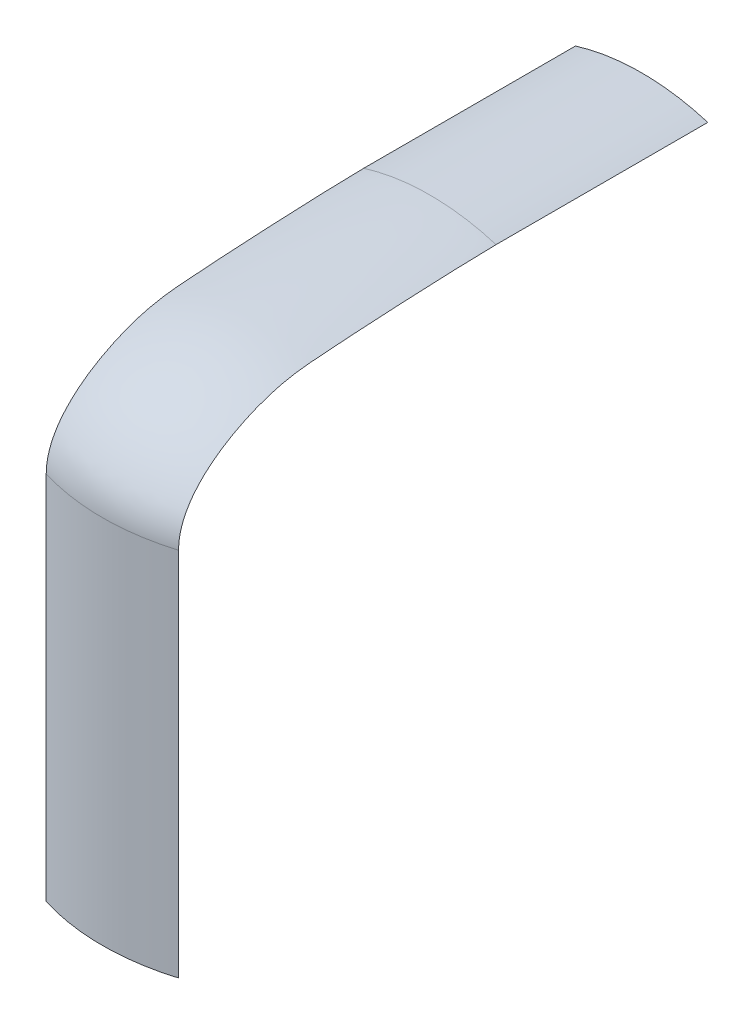
ISO-10303-21;
HEADER;
FILE_DESCRIPTION(('STEP AP214'),'2;1');
FILE_NAME('part.step','',(''),(''),'','','');
FILE_SCHEMA(('AUTOMOTIVE_DESIGN { 1 0 10303 214 1 1 1 1 }'));
ENDSEC;
DATA;
#1=APPLICATION_CONTEXT('core data for automotive mechanical design processes');
#2=APPLICATION_PROTOCOL_DEFINITION('international standard','automotive_design',2000,#1);
#3=PRODUCT_CONTEXT('',#1,'mechanical');
#4=PRODUCT('Part','Part','',(#3));
#5=PRODUCT_RELATED_PRODUCT_CATEGORY('part','',(#4));
#6=PRODUCT_DEFINITION_FORMATION('','',#4);
#7=PRODUCT_DEFINITION_CONTEXT('part definition',#1,'design');
#8=PRODUCT_DEFINITION('design','',#6,#7);
#9=PRODUCT_DEFINITION_SHAPE('','',#8);
#10=(LENGTH_UNIT() NAMED_UNIT(*) SI_UNIT(.MILLI.,.METRE.));
#11=(NAMED_UNIT(*) PLANE_ANGLE_UNIT() SI_UNIT($,.RADIAN.));
#12=(NAMED_UNIT(*) SI_UNIT($,.STERADIAN.) SOLID_ANGLE_UNIT());
#13=UNCERTAINTY_MEASURE_WITH_UNIT(LENGTH_MEASURE(1.E-05),#10,'distance_accuracy_value','');
#14=(GEOMETRIC_REPRESENTATION_CONTEXT(3) GLOBAL_UNCERTAINTY_ASSIGNED_CONTEXT((#13)) GLOBAL_UNIT_ASSIGNED_CONTEXT((#10,
#11,#12)) REPRESENTATION_CONTEXT('',''));
#15=CARTESIAN_POINT('',(0.,0.,0.));
#16=DIRECTION('',(0.,0.,1.));
#17=DIRECTION('',(1.,0.,0.));
#18=AXIS2_PLACEMENT_3D('',#15,#16,#17);
#19=CARTESIAN_POINT('',(0.,-180.,200.));
#20=DIRECTION('',(0.,-1.,0.));
#21=DIRECTION('',(1.,0.,0.));
#22=AXIS2_PLACEMENT_3D('',#19,#20,#21);
#23=PLANE('',#22);
#24=CARTESIAN_POINT('',(0.,-180.,281.458333333333));
#25=DIRECTION('',(0.,-1.,0.));
#26=DIRECTION('',(1.,0.,0.));
#27=AXIS2_PLACEMENT_3D('',#24,#25,#26);
#28=CIRCLE('',#27,85.2083333333334);
#29=CARTESIAN_POINT('',(-25.,-180.,200.));
#30=VERTEX_POINT('',#29);
#31=CARTESIAN_POINT('',(25.,-180.,200.));
#32=VERTEX_POINT('',#31);
#33=EDGE_CURVE('E78',#30,#32,#28,.T.);
#34=ORIENTED_EDGE('',*,*,#33,.T.);
#35=CARTESIAN_POINT('',(0.,-180.,118.541666666667));
#36=DIRECTION('',(0.,-1.,0.));
#37=DIRECTION('',(-1.,0.,0.));
#38=AXIS2_PLACEMENT_3D('',#35,#36,#37);
#39=CIRCLE('',#38,85.2083333333334);
#40=EDGE_CURVE('E87',#32,#30,#39,.T.);
#41=ORIENTED_EDGE('',*,*,#40,.T.);
#42=EDGE_LOOP('',(#34,#41));
#43=FACE_BOUND('',#42,.T.);
#44=ADVANCED_FACE('F33',(#43),#23,.T.);
#45=CARTESIAN_POINT('',(0.,0.,0.));
#46=DIRECTION('',(0.,0.,1.));
#47=DIRECTION('',(1.,0.,0.));
#48=AXIS2_PLACEMENT_3D('',#45,#46,#47);
#49=PLANE('',#48);
#50=CARTESIAN_POINT('',(0.,81.4583333333334,0.));
#51=DIRECTION('',(0.,0.,1.));
#52=DIRECTION('',(1.,0.,0.));
#53=AXIS2_PLACEMENT_3D('',#50,#51,#52);
#54=CIRCLE('',#53,85.2083333333334);
#55=CARTESIAN_POINT('',(-25.,0.,0.));
#56=VERTEX_POINT('',#55);
#57=CARTESIAN_POINT('',(25.,0.,0.));
#58=VERTEX_POINT('',#57);
#59=EDGE_CURVE('E51',#56,#58,#54,.T.);
#60=ORIENTED_EDGE('',*,*,#59,.F.);
#61=CARTESIAN_POINT('',(0.,-81.4583333333334,0.));
#62=DIRECTION('',(0.,0.,1.));
#63=DIRECTION('',(-1.,0.,0.));
#64=AXIS2_PLACEMENT_3D('',#61,#62,#63);
#65=CIRCLE('',#64,85.2083333333334);
#66=EDGE_CURVE('E11',#58,#56,#65,.T.);
#67=ORIENTED_EDGE('',*,*,#66,.F.);
#68=EDGE_LOOP('',(#60,#67));
#69=FACE_BOUND('',#68,.T.);
#70=ADVANCED_FACE('F146',(#69),#49,.F.);
#71=CARTESIAN_POINT('',(0.,-180.,281.458333333333));
#72=DIRECTION('',(0.,1.,0.));
#73=DIRECTION('',(0.,0.,1.));
#74=AXIS2_PLACEMENT_3D('',#71,#72,#73);
#75=CYLINDRICAL_SURFACE('',#74,85.2083333333334);
#76=DIRECTION('',(0.,1.,0.));
#77=VECTOR('',#76,1.);
#78=CARTESIAN_POINT('',(25.,-180.,200.));
#79=LINE('',#78,#77);
#80=CARTESIAN_POINT('',(25.,-40.0000000000001,200.));
#81=VERTEX_POINT('',#80);
#82=EDGE_CURVE('E85',#32,#81,#79,.T.);
#83=ORIENTED_EDGE('',*,*,#82,.F.);
#84=ORIENTED_EDGE('',*,*,#33,.F.);
#85=DIRECTION('',(0.,1.,0.));
#86=VECTOR('',#85,1.);
#87=CARTESIAN_POINT('',(-25.,-180.,200.));
#88=LINE('',#87,#86);
#89=CARTESIAN_POINT('',(-25.,-40.0000000000001,200.));
#90=VERTEX_POINT('',#89);
#91=EDGE_CURVE('E83',#30,#90,#88,.T.);
#92=ORIENTED_EDGE('',*,*,#91,.T.);
#93=CARTESIAN_POINT('',(0.,-40.0000000000001,281.458333333333));
#94=DIRECTION('',(0.,-1.,0.));
#95=DIRECTION('',(1.,0.,0.));
#96=AXIS2_PLACEMENT_3D('',#93,#94,#95);
#97=CIRCLE('',#96,85.2083333333334);
#98=EDGE_CURVE('E96',#90,#81,#97,.T.);
#99=ORIENTED_EDGE('',*,*,#98,.T.);
#100=EDGE_LOOP('',(#83,#84,#92,#99));
#101=FACE_BOUND('',#100,.T.);
#102=ADVANCED_FACE('F80',(#101),#75,.T.);
#103=CARTESIAN_POINT('',(0.,-180.,118.541666666667));
#104=DIRECTION('',(0.,1.,0.));
#105=DIRECTION('',(0.,0.,1.));
#106=AXIS2_PLACEMENT_3D('',#103,#104,#105);
#107=CYLINDRICAL_SURFACE('',#106,85.2083333333334);
#108=CARTESIAN_POINT('',(0.,-40.0000000000002,118.541666666667));
#109=DIRECTION('',(0.,-1.,0.));
#110=DIRECTION('',(-1.,0.,0.));
#111=AXIS2_PLACEMENT_3D('',#108,#109,#110);
#112=CIRCLE('',#111,85.2083333333334);
#113=EDGE_CURVE('E94',#81,#90,#112,.T.);
#114=ORIENTED_EDGE('',*,*,#113,.T.);
#115=ORIENTED_EDGE('',*,*,#91,.F.);
#116=ORIENTED_EDGE('',*,*,#40,.F.);
#117=ORIENTED_EDGE('',*,*,#82,.T.);
#118=EDGE_LOOP('',(#114,#115,#116,#117));
#119=FACE_BOUND('',#118,.T.);
#120=ADVANCED_FACE('F92',(#119),#107,.T.);
#121=CARTESIAN_POINT('',(-25.,-40.0000000000001,200.));
#122=CARTESIAN_POINT('',(-25.,-37.3306857335787,200.));
#123=CARTESIAN_POINT('',(-25.,-34.8787437313091,199.531631433012));
#124=CARTESIAN_POINT('',(-25.,-30.3415183705615,197.968601367359));
#125=CARTESIAN_POINT('',(-25.,-28.2576864510315,196.873434489137));
#126=CARTESIAN_POINT('',(-25.,-24.3997824908239,194.264646805378));
#127=CARTESIAN_POINT('',(-25.,-22.6277913273673,192.751411462993));
#128=CARTESIAN_POINT('',(-25.,-19.3520951309848,189.448973303045));
#129=CARTESIAN_POINT('',(-25.,-17.8466933525847,187.657285044243));
#130=CARTESIAN_POINT('',(-25.,-13.6807807077978,182.001893570433));
#131=CARTESIAN_POINT('',(-25.,-11.3690125939985,177.868665609129));
#132=CARTESIAN_POINT('',(-25.,-7.58085180850919,169.38999754975));
#133=CARTESIAN_POINT('',(-25.,-6.10221544852143,165.028826172504));
#134=CARTESIAN_POINT('',(-25.,-4.55601940668524,158.451232984599));
#135=CARTESIAN_POINT('',(-25.,-4.16212703673915,156.130796769562));
#136=CARTESIAN_POINT('',(-25.,-3.57310015555692,151.44049274052));
#137=CARTESIAN_POINT('',(-25.,-3.37989773734633,149.072683495324));
#138=CARTESIAN_POINT('',(-25.,-2.84289184750159,141.957401498748));
#139=CARTESIAN_POINT('',(-25.,-2.49367068556293,136.838925194618));
#140=CARTESIAN_POINT('',(-25.,-1.80738921850939,125.593045305891));
#141=CARTESIAN_POINT('',(-25.,-1.47123075885249,119.472511767019));
#142=CARTESIAN_POINT('',(-25.,-1.00705817319474,109.922778741828));
#143=CARTESIAN_POINT('',(-25.,-0.859528251382353,106.688646994288));
#144=CARTESIAN_POINT('',(-25.,-0.58758764234243,100.282335622467));
#145=CARTESIAN_POINT('',(-25.,-0.463428284406223,97.1156390944795));
#146=CARTESIAN_POINT('',(-25.,-0.250421529442086,91.1171888743248));
#147=CARTESIAN_POINT('',(-25.,-0.161919947513193,88.2946986949963));
#148=CARTESIAN_POINT('',(-25.,-0.0365857471920022,83.4095105236268));
#149=CARTESIAN_POINT('',(-25.,0.,81.3549737795154));
#150=CARTESIAN_POINT('',(-25.,0.,80.));
#151=CARTESIAN_POINT('',(-8.5852225020991,-40.0000000000001,194.962216624685));
#152=CARTESIAN_POINT('',(-8.5852225020991,-37.9294067299026,194.962216624685));
#153=CARTESIAN_POINT('',(-8.5852225020991,-36.0424978668688,194.604202680078));
#154=CARTESIAN_POINT('',(-8.5852225020991,-32.4594332742299,193.369871730712));
#155=CARTESIAN_POINT('',(-8.5852225020991,-30.7650988371726,192.487506894555));
#156=CARTESIAN_POINT('',(-8.5852225020991,-27.5363634373998,190.304174900377));
#157=CARTESIAN_POINT('',(-8.5852225020991,-26.0067894722717,189.004352894051));
#158=CARTESIAN_POINT('',(-8.5852225020991,-23.1265025503581,186.100552030613));
#159=CARTESIAN_POINT('',(-8.5852225020991,-21.7746211488305,184.49542507021));
#160=CARTESIAN_POINT('',(-8.5852225020991,-17.9932671843688,179.362087241433));
#161=CARTESIAN_POINT('',(-8.5852225020991,-15.8401630238066,175.526189951975));
#162=CARTESIAN_POINT('',(-8.5852225020991,-12.3088544295612,167.622408913825));
#163=CARTESIAN_POINT('',(-8.5852225020991,-10.9258370561077,163.533616565803));
#164=CARTESIAN_POINT('',(-8.5852225020991,-9.50607007793297,157.493858766075));
#165=CARTESIAN_POINT('',(-8.5852225020991,-9.14287395267868,155.361531927543));
#166=CARTESIAN_POINT('',(-8.5852225020991,-8.58939508115935,150.954289635974));
#167=CARTESIAN_POINT('',(-8.5852225020991,-8.40229413309878,148.678971017739));
#168=CARTESIAN_POINT('',(-8.5852225020991,-7.86841094161886,141.605064506583));
#169=CARTESIAN_POINT('',(-8.5852225020991,-7.5207610730851,136.510129657968));
#170=CARTESIAN_POINT('',(-8.5852225020991,-6.83715676973377,125.308119614079));
#171=CARTESIAN_POINT('',(-8.5852225020991,-6.50209046065075,119.207705837792));
#172=CARTESIAN_POINT('',(-8.5852225020991,-6.0393927519212,109.688316442038));
#173=CARTESIAN_POINT('',(-8.5852225020991,-5.89232556950738,106.464310704875));
#174=CARTESIAN_POINT('',(-8.5852225020991,-5.62129171391345,100.079360412337));
#175=CARTESIAN_POINT('',(-8.5852225020991,-5.49757437023407,96.9237915342177));
#176=CARTESIAN_POINT('',(-8.5852225020991,-5.28549564531757,90.9514754244014));
#177=CARTESIAN_POINT('',(-8.5852225020991,-5.19747769654424,88.143335843762));
#178=CARTESIAN_POINT('',(-8.5852225020991,-5.07328037298383,83.302460054248));
#179=CARTESIAN_POINT('',(-8.5852225020991,-5.03778337531486,81.2722569599734));
#180=CARTESIAN_POINT('',(-8.5852225020991,-5.03778337531486,80.));
#181=CARTESIAN_POINT('',(8.58522250209906,-40.0000000000001,194.962216624685));
#182=CARTESIAN_POINT('',(8.58522250209906,-37.9294067299026,194.962216624685));
#183=CARTESIAN_POINT('',(8.58522250209906,-36.0424978668688,194.604202680111));
#184=CARTESIAN_POINT('',(8.58522250209906,-32.4594332742299,193.369871730679));
#185=CARTESIAN_POINT('',(8.58522250209906,-30.7650988371726,192.487506894555));
#186=CARTESIAN_POINT('',(8.58522250209906,-27.5363634373998,190.304174900377));
#187=CARTESIAN_POINT('',(8.58522250209906,-26.0067894722717,189.004352894051));
#188=CARTESIAN_POINT('',(8.58522250209906,-23.1265025503581,186.100552030613));
#189=CARTESIAN_POINT('',(8.58522250209906,-21.7746211488345,184.49542507021));
#190=CARTESIAN_POINT('',(8.58522250209906,-17.9932671843607,179.362087241433));
#191=CARTESIAN_POINT('',(8.58522250209906,-15.8401630238066,175.526189952039));
#192=CARTESIAN_POINT('',(8.58522250209906,-12.3088544295612,167.622408913761));
#193=CARTESIAN_POINT('',(8.58522250209906,-10.925837056104,163.533616565803));
#194=CARTESIAN_POINT('',(8.58522250209906,-9.5060700779351,157.493858766075));
#195=CARTESIAN_POINT('',(8.58522250209906,-9.14287395267869,155.361531927543));
#196=CARTESIAN_POINT('',(8.58522250209906,-8.58939508115935,150.954289635974));
#197=CARTESIAN_POINT('',(8.58522250209906,-8.40229413310097,148.678971017739));
#198=CARTESIAN_POINT('',(8.58522250209906,-7.86841094161486,141.605064506583));
#199=CARTESIAN_POINT('',(8.58522250209906,-7.52076107308511,136.510129657968));
#200=CARTESIAN_POINT('',(8.58522250209906,-6.83715676973377,125.308119614079));
#201=CARTESIAN_POINT('',(8.58522250209906,-6.50209046064799,119.207705837792));
#202=CARTESIAN_POINT('',(8.58522250209906,-6.03939275192259,109.688316442038));
#203=CARTESIAN_POINT('',(8.58522250209906,-5.89232556950739,106.464310704875));
#204=CARTESIAN_POINT('',(8.58522250209906,-5.62129171391346,100.079360412337));
#205=CARTESIAN_POINT('',(8.58522250209906,-5.49757437023408,96.9237915342177));
#206=CARTESIAN_POINT('',(8.58522250209906,-5.28549564531758,90.9514754244014));
#207=CARTESIAN_POINT('',(8.58522250209906,-5.19747769654424,88.143335843762));
#208=CARTESIAN_POINT('',(8.58522250209906,-5.07328037298383,83.302460054248));
#209=CARTESIAN_POINT('',(8.58522250209906,-5.03778337531486,81.2722569599734));
#210=CARTESIAN_POINT('',(8.58522250209906,-5.03778337531486,80.));
#211=CARTESIAN_POINT('',(25.,-40.0000000000001,200.));
#212=CARTESIAN_POINT('',(25.,-37.3306857335787,200.));
#213=CARTESIAN_POINT('',(25.,-34.8787437313091,199.531631433012));
#214=CARTESIAN_POINT('',(25.,-30.3415183705615,197.968601367359));
#215=CARTESIAN_POINT('',(25.,-28.2576864510315,196.873434489137));
#216=CARTESIAN_POINT('',(25.,-24.3997824908239,194.264646805378));
#217=CARTESIAN_POINT('',(25.,-22.6277913273673,192.751411462993));
#218=CARTESIAN_POINT('',(25.,-19.3520951309848,189.448973303045));
#219=CARTESIAN_POINT('',(25.,-17.8466933525847,187.657285044243));
#220=CARTESIAN_POINT('',(25.,-13.6807807077978,182.001893570433));
#221=CARTESIAN_POINT('',(25.,-11.3690125939985,177.868665609129));
#222=CARTESIAN_POINT('',(25.,-7.5808518085092,169.38999754975));
#223=CARTESIAN_POINT('',(25.,-6.10221544852144,165.028826172504));
#224=CARTESIAN_POINT('',(25.,-4.55601940668525,158.451232984599));
#225=CARTESIAN_POINT('',(25.,-4.16212703673916,156.130796769562));
#226=CARTESIAN_POINT('',(25.,-3.57310015555693,151.44049274052));
#227=CARTESIAN_POINT('',(25.,-3.37989773734634,149.072683495324));
#228=CARTESIAN_POINT('',(25.,-2.8428918475016,141.957401498748));
#229=CARTESIAN_POINT('',(25.,-2.49367068556294,136.838925194618));
#230=CARTESIAN_POINT('',(25.,-1.8073892185094,125.593045305891));
#231=CARTESIAN_POINT('',(25.,-1.4712307588525,119.472511767019));
#232=CARTESIAN_POINT('',(25.,-1.00705817319476,109.922778741828));
#233=CARTESIAN_POINT('',(25.,-0.859528251382367,106.688646994288));
#234=CARTESIAN_POINT('',(25.,-0.587587642342443,100.282335622467));
#235=CARTESIAN_POINT('',(25.,-0.463428284406237,97.1156390944795));
#236=CARTESIAN_POINT('',(25.,-0.2504215294421,91.1171888743248));
#237=CARTESIAN_POINT('',(25.,-0.161919947513207,88.2946986949963));
#238=CARTESIAN_POINT('',(25.,-0.0365857471920161,83.4095105236268));
#239=CARTESIAN_POINT('',(25.,0.,81.3549737795154));
#240=CARTESIAN_POINT('',(25.,0.,80.));
#241=(BOUNDED_SURFACE() B_SPLINE_SURFACE(3,3,((#121,#122,#123,#124,#125,#126,#127,#128,#129,
#130,#131,#132,#133,#134,#135,#136,#137,#138,#139,#140,#141,#142,#143,#144,#145,#146,#147,#148,
#149,#150),(#151,#152,#153,#154,#155,#156,#157,#158,#159,#160,#161,#162,#163,#164,#165,#166,
#167,#168,#169,#170,#171,#172,#173,#174,#175,#176,#177,#178,#179,#180),(#181,#182,#183,#184,
#185,#186,#187,#188,#189,#190,#191,#192,#193,#194,#195,#196,#197,#198,#199,#200,#201,#202,#203,
#204,#205,#206,#207,#208,#209,#210),(#211,#212,#213,#214,#215,#216,#217,#218,#219,#220,#221,
#222,#223,#224,#225,#226,#227,#228,#229,#230,#231,#232,#233,#234,#235,#236,#237,#238,#239,
#240)),.UNSPECIFIED.,.F.,.F.,.F.) B_SPLINE_SURFACE_WITH_KNOTS((4,4),(4,2,2,2,2,2,2,2,2,2,2,2,2,
2,4),(0.,1.),(0.391949738903916,0.412514329939405,0.433078920974894,0.453643512010383,
0.474208103045872,0.51533728511685,0.556466467187829,0.57994228253645,0.603418097885072,
0.646570753570388,0.689723409255703,0.711299737098361,0.732876064941018,0.754452392783676,
0.776028720626333),
.UNSPECIFIED.) GEOMETRIC_REPRESENTATION_ITEM() RATIONAL_B_SPLINE_SURFACE(((1.,1.,1.,1.,1.,1.,1.,
1.,1.,1.,1.,1.,1.,1.,1.,1.,1.,1.,1.,1.,1.,1.,1.,1.,1.,1.,1.,1.,1.,1.),(0.970660146699267,
0.970660146699267,0.970660146699267,0.970660146699267,0.970660146699267,0.970660146699267,
0.970660146699267,0.970660146699267,0.970660146699267,0.970660146699267,0.970660146699267,
0.970660146699267,0.970660146699267,0.970660146699267,0.970660146699267,0.970660146699267,
0.970660146699267,0.970660146699267,0.970660146699267,0.970660146699267,0.970660146699267,
0.970660146699267,0.970660146699267,0.970660146699267,0.970660146699267,0.970660146699267,
0.970660146699267,0.970660146699267,0.970660146699267,0.970660146699267),(0.970660146699267,
0.970660146699267,0.970660146699267,0.970660146699267,0.970660146699267,0.970660146699267,
0.970660146699267,0.970660146699267,0.970660146699267,0.970660146699267,0.970660146699267,
0.970660146699267,0.970660146699267,0.970660146699267,0.970660146699267,0.970660146699267,
0.970660146699267,0.970660146699267,0.970660146699267,0.970660146699267,0.970660146699267,
0.970660146699267,0.970660146699267,0.970660146699267,0.970660146699267,0.970660146699267,
0.970660146699267,0.970660146699267,0.970660146699267,0.970660146699267),(1.,1.,1.,1.,1.,1.,1.,
1.,1.,1.,1.,1.,1.,1.,1.,1.,1.,1.,1.,1.,1.,1.,1.,1.,1.,1.,1.,1.,1.,1.))) REPRESENTATION_ITEM('') SURFACE());
#242=CARTESIAN_POINT('',(25.,-40.0000000000001,200.));
#243=CARTESIAN_POINT('',(25.,-37.3306857335787,200.));
#244=CARTESIAN_POINT('',(25.,-34.8787437313091,199.531631433012));
#245=CARTESIAN_POINT('',(25.,-30.3415183705615,197.968601367359));
#246=CARTESIAN_POINT('',(25.,-28.2576864510315,196.873434489137));
#247=CARTESIAN_POINT('',(25.,-24.3997824908239,194.264646805378));
#248=CARTESIAN_POINT('',(25.,-22.6277913273673,192.751411462993));
#249=CARTESIAN_POINT('',(25.,-19.3520951309848,189.448973303045));
#250=CARTESIAN_POINT('',(25.,-17.8466933525847,187.657285044243));
#251=CARTESIAN_POINT('',(25.,-13.6807807077978,182.001893570433));
#252=CARTESIAN_POINT('',(25.,-11.3690125939985,177.868665609129));
#253=CARTESIAN_POINT('',(25.,-7.5808518085092,169.38999754975));
#254=CARTESIAN_POINT('',(25.,-6.10221544852144,165.028826172504));
#255=CARTESIAN_POINT('',(25.,-4.55601940668525,158.451232984599));
#256=CARTESIAN_POINT('',(25.,-4.16212703673916,156.130796769562));
#257=CARTESIAN_POINT('',(25.,-3.57310015555693,151.44049274052));
#258=CARTESIAN_POINT('',(25.,-3.37989773734634,149.072683495324));
#259=CARTESIAN_POINT('',(25.,-2.8428918475016,141.957401498748));
#260=CARTESIAN_POINT('',(25.,-2.49367068556294,136.838925194618));
#261=CARTESIAN_POINT('',(25.,-1.8073892185094,125.593045305891));
#262=CARTESIAN_POINT('',(25.,-1.4712307588525,119.472511767019));
#263=CARTESIAN_POINT('',(25.,-1.00705817319476,109.922778741828));
#264=CARTESIAN_POINT('',(25.,-0.859528251382367,106.688646994288));
#265=CARTESIAN_POINT('',(25.,-0.587587642342443,100.282335622467));
#266=CARTESIAN_POINT('',(25.,-0.463428284406237,97.1156390944795));
#267=CARTESIAN_POINT('',(25.,-0.2504215294421,91.1171888743248));
#268=CARTESIAN_POINT('',(25.,-0.161919947513207,88.2946986949963));
#269=CARTESIAN_POINT('',(25.,-0.0365857471920161,83.4095105236268));
#270=CARTESIAN_POINT('',(25.,0.,81.3549737795154));
#271=CARTESIAN_POINT('',(25.,0.,80.));
#272=B_SPLINE_CURVE_WITH_KNOTS('',3,(#242,#243,#244,#245,#246,#247,#248,#249,#250,#251,#252,
#253,#254,#255,#256,#257,#258,#259,#260,#261,#262,#263,#264,#265,#266,#267,#268,#269,#270,#271),
.UNSPECIFIED.,.F.,.F.,(4,2,2,2,2,2,2,2,2,2,2,2,2,2,4),(0.391949738903916,0.412514329939405,
0.433078920974894,0.453643512010383,0.474208103045872,0.51533728511685,0.556466467187829,
0.57994228253645,0.603418097885072,0.646570753570388,0.689723409255703,0.711299737098361,
0.732876064941018,0.754452392783676,0.776028720626333),.UNSPECIFIED.);
#273=CARTESIAN_POINT('',(25.,0.,80.));
#274=VERTEX_POINT('',#273);
#275=EDGE_CURVE('E105',#81,#274,#272,.T.);
#276=CARTESIAN_POINT('',(-25.,-40.0000000000001,200.));
#277=CARTESIAN_POINT('',(-25.,-37.3306857335787,200.));
#278=CARTESIAN_POINT('',(-25.,-34.8787437313091,199.531631433012));
#279=CARTESIAN_POINT('',(-25.,-30.3415183705615,197.968601367359));
#280=CARTESIAN_POINT('',(-25.,-28.2576864510315,196.873434489137));
#281=CARTESIAN_POINT('',(-25.,-24.3997824908239,194.264646805378));
#282=CARTESIAN_POINT('',(-25.,-22.6277913273673,192.751411462993));
#283=CARTESIAN_POINT('',(-25.,-19.3520951309848,189.448973303045));
#284=CARTESIAN_POINT('',(-25.,-17.8466933525847,187.657285044243));
#285=CARTESIAN_POINT('',(-25.,-13.6807807077978,182.001893570433));
#286=CARTESIAN_POINT('',(-25.,-11.3690125939985,177.868665609129));
#287=CARTESIAN_POINT('',(-25.,-7.58085180850919,169.38999754975));
#288=CARTESIAN_POINT('',(-25.,-6.10221544852143,165.028826172504));
#289=CARTESIAN_POINT('',(-25.,-4.55601940668524,158.451232984599));
#290=CARTESIAN_POINT('',(-25.,-4.16212703673915,156.130796769562));
#291=CARTESIAN_POINT('',(-25.,-3.57310015555692,151.44049274052));
#292=CARTESIAN_POINT('',(-25.,-3.37989773734633,149.072683495324));
#293=CARTESIAN_POINT('',(-25.,-2.84289184750159,141.957401498748));
#294=CARTESIAN_POINT('',(-25.,-2.49367068556293,136.838925194618));
#295=CARTESIAN_POINT('',(-25.,-1.80738921850939,125.593045305891));
#296=CARTESIAN_POINT('',(-25.,-1.47123075885249,119.472511767019));
#297=CARTESIAN_POINT('',(-25.,-1.00705817319474,109.922778741828));
#298=CARTESIAN_POINT('',(-25.,-0.859528251382353,106.688646994288));
#299=CARTESIAN_POINT('',(-25.,-0.58758764234243,100.282335622467));
#300=CARTESIAN_POINT('',(-25.,-0.463428284406223,97.1156390944795));
#301=CARTESIAN_POINT('',(-25.,-0.250421529442086,91.1171888743248));
#302=CARTESIAN_POINT('',(-25.,-0.161919947513193,88.2946986949963));
#303=CARTESIAN_POINT('',(-25.,-0.0365857471920022,83.4095105236268));
#304=CARTESIAN_POINT('',(-25.,0.,81.3549737795154));
#305=CARTESIAN_POINT('',(-25.,0.,80.));
#306=B_SPLINE_CURVE_WITH_KNOTS('',3,(#276,#277,#278,#279,#280,#281,#282,#283,#284,#285,#286,
#287,#288,#289,#290,#291,#292,#293,#294,#295,#296,#297,#298,#299,#300,#301,#302,#303,#304,#305),
.UNSPECIFIED.,.F.,.F.,(4,2,2,2,2,2,2,2,2,2,2,2,2,2,4),(0.391949738903916,0.412514329939405,
0.433078920974894,0.453643512010383,0.474208103045872,0.51533728511685,0.556466467187829,
0.57994228253645,0.603418097885072,0.646570753570388,0.689723409255703,0.711299737098361,
0.732876064941018,0.754452392783676,0.776028720626333),.UNSPECIFIED.);
#307=CARTESIAN_POINT('',(-25.,0.,80.));
#308=VERTEX_POINT('',#307);
#309=EDGE_CURVE('E36',#90,#308,#306,.T.);
#310=CARTESIAN_POINT('',(0.,81.4583333333334,80.));
#311=DIRECTION('',(0.,0.,1.));
#312=DIRECTION('',(1.,0.,0.));
#313=AXIS2_PLACEMENT_3D('',#310,#311,#312);
#314=CIRCLE('',#313,85.2083333333334);
#315=EDGE_CURVE('E101',#308,#274,#314,.T.);
#316=ORIENTED_EDGE('',*,*,#275,.F.);
#317=ORIENTED_EDGE('',*,*,#98,.F.);
#318=ORIENTED_EDGE('',*,*,#309,.T.);
#319=ORIENTED_EDGE('',*,*,#315,.T.);
#320=EDGE_LOOP('',(#316,#317,#318,#319));
#321=FACE_BOUND('',#320,.T.);
#322=ADVANCED_FACE('F119',(#321),#241,.F.);
#323=CARTESIAN_POINT('',(25.,-40.0000000000001,200.));
#324=CARTESIAN_POINT('',(25.,-37.3306857335787,200.));
#325=CARTESIAN_POINT('',(25.,-34.8787437313091,199.531631433012));
#326=CARTESIAN_POINT('',(25.,-30.3415183705615,197.968601367359));
#327=CARTESIAN_POINT('',(25.,-28.2576864510315,196.873434489137));
#328=CARTESIAN_POINT('',(25.,-24.3997824908239,194.264646805378));
#329=CARTESIAN_POINT('',(25.,-22.6277913273673,192.751411462993));
#330=CARTESIAN_POINT('',(25.,-19.3520951309848,189.448973303045));
#331=CARTESIAN_POINT('',(25.,-17.8466933525847,187.657285044243));
#332=CARTESIAN_POINT('',(25.,-13.6807807077978,182.001893570433));
#333=CARTESIAN_POINT('',(25.,-11.3690125939985,177.868665609129));
#334=CARTESIAN_POINT('',(25.,-7.58085180850921,169.38999754975));
#335=CARTESIAN_POINT('',(25.,-6.10221544852145,165.028826172504));
#336=CARTESIAN_POINT('',(25.,-4.55601940668527,158.451232984599));
#337=CARTESIAN_POINT('',(25.,-4.16212703673917,156.130796769562));
#338=CARTESIAN_POINT('',(25.,-3.57310015555695,151.44049274052));
#339=CARTESIAN_POINT('',(25.,-3.37989773734636,149.072683495324));
#340=CARTESIAN_POINT('',(25.,-2.84289184750162,141.957401498748));
#341=CARTESIAN_POINT('',(25.,-2.49367068556296,136.838925194618));
#342=CARTESIAN_POINT('',(25.,-1.80738921850942,125.593045305891));
#343=CARTESIAN_POINT('',(25.,-1.47123075885251,119.472511767019));
#344=CARTESIAN_POINT('',(25.,-1.00705817319477,109.922778741828));
#345=CARTESIAN_POINT('',(25.,-0.85952825138238,106.688646994288));
#346=CARTESIAN_POINT('',(25.,-0.587587642342457,100.282335622467));
#347=CARTESIAN_POINT('',(25.,-0.463428284406251,97.1156390944795));
#348=CARTESIAN_POINT('',(25.,-0.250421529442114,91.1171888743248));
#349=CARTESIAN_POINT('',(25.,-0.161919947513221,88.2946986949963));
#350=CARTESIAN_POINT('',(25.,-0.03658574719203,83.4095105236268));
#351=CARTESIAN_POINT('',(25.,0.,81.3549737795154));
#352=CARTESIAN_POINT('',(25.,0.,80.));
#353=CARTESIAN_POINT('',(8.5852225020991,-40.0000000000001,205.037783375315));
#354=CARTESIAN_POINT('',(8.5852225020991,-36.7319647372549,205.037783375315));
#355=CARTESIAN_POINT('',(8.5852225020991,-33.7149895957494,204.459060185945));
#356=CARTESIAN_POINT('',(8.5852225020991,-28.223603466893,202.567331004005));
#357=CARTESIAN_POINT('',(8.5852225020991,-25.7502740648904,201.259362083719));
#358=CARTESIAN_POINT('',(8.5852225020991,-21.2632015442481,198.225118710378));
#359=CARTESIAN_POINT('',(8.5852225020991,-19.2487931824628,196.498470031935));
#360=CARTESIAN_POINT('',(8.5852225020991,-15.5776877116114,192.797394575478));
#361=CARTESIAN_POINT('',(8.5852225020991,-13.9187655563389,190.819145018276));
#362=CARTESIAN_POINT('',(8.5852225020991,-9.36829423122674,184.641699899434));
#363=CARTESIAN_POINT('',(8.5852225020991,-6.89786216419233,180.211141266283));
#364=CARTESIAN_POINT('',(8.5852225020991,-2.85284918745516,171.157586185675));
#365=CARTESIAN_POINT('',(8.5852225020991,-1.27859384093704,166.524035779206));
#366=CARTESIAN_POINT('',(8.5852225020991,0.394031264563521,159.408607203122));
#367=CARTESIAN_POINT('',(8.5852225020991,0.818619879200365,156.900061611581));
#368=CARTESIAN_POINT('',(8.5852225020991,1.44319477004548,151.926695845067));
#369=CARTESIAN_POINT('',(8.5852225020991,1.64249865840609,149.466395972909));
#370=CARTESIAN_POINT('',(8.5852225020991,2.18262724661566,142.309738490914));
#371=CARTESIAN_POINT('',(8.5852225020991,2.53341970195921,137.167720731269));
#372=CARTESIAN_POINT('',(8.5852225020991,3.22237833271496,125.877970997703));
#373=CARTESIAN_POINT('',(8.5852225020991,3.55962894294437,119.737317696246));
#374=CARTESIAN_POINT('',(8.5852225020991,4.02527640553238,110.157241041619));
#375=CARTESIAN_POINT('',(8.5852225020991,4.17326906674439,106.912983283702));
#376=CARTESIAN_POINT('',(8.5852225020991,4.44611642922683,100.485310832598));
#377=CARTESIAN_POINT('',(8.5852225020991,4.57071780142062,97.3074866547414));
#378=CARTESIAN_POINT('',(8.5852225020991,4.78465258643435,91.2829023242483));
#379=CARTESIAN_POINT('',(8.5852225020991,4.87363780151709,88.4460615462307));
#380=CARTESIAN_POINT('',(8.5852225020991,5.00010887860052,83.5165609930057));
#381=CARTESIAN_POINT('',(8.5852225020991,5.03778337531484,81.4376905990575));
#382=CARTESIAN_POINT('',(8.5852225020991,5.03778337531484,80.));
#383=CARTESIAN_POINT('',(-8.58522250209906,-40.0000000000001,205.037783375315));
#384=CARTESIAN_POINT('',(-8.58522250209906,-36.731964737258,205.037783375315));
#385=CARTESIAN_POINT('',(-8.58522250209906,-33.7149895957453,204.459060185912));
#386=CARTESIAN_POINT('',(-8.58522250209906,-28.2236034668972,202.567331004039));
#387=CARTESIAN_POINT('',(-8.58522250209906,-25.7502740648904,201.259362083719));
#388=CARTESIAN_POINT('',(-8.58522250209906,-21.2632015442481,198.225118710378));
#389=CARTESIAN_POINT('',(-8.58522250209906,-19.2487931824628,196.498470031935));
#390=CARTESIAN_POINT('',(-8.58522250209906,-15.5776877116114,192.797394575478));
#391=CARTESIAN_POINT('',(-8.58522250209906,-13.9187655563369,190.819145018276));
#392=CARTESIAN_POINT('',(-8.58522250209906,-9.36829423123079,184.641699899434));
#393=CARTESIAN_POINT('',(-8.58522250209906,-6.89786216419232,180.211141266219));
#394=CARTESIAN_POINT('',(-8.58522250209906,-2.85284918745515,171.15758618574));
#395=CARTESIAN_POINT('',(-8.58522250209906,-1.27859384093704,166.524035779206));
#396=CARTESIAN_POINT('',(-8.58522250209906,0.394031264563529,159.408607203122));
#397=CARTESIAN_POINT('',(-8.58522250209906,0.818619879200373,156.900061611581));
#398=CARTESIAN_POINT('',(-8.58522250209906,1.44319477004549,151.926695845067));
#399=CARTESIAN_POINT('',(-8.58522250209906,1.6424986584061,149.466395972909));
#400=CARTESIAN_POINT('',(-8.58522250209906,2.18262724661566,142.309738490914));
#401=CARTESIAN_POINT('',(-8.58522250209906,2.53341970195922,137.167720731269));
#402=CARTESIAN_POINT('',(-8.58522250209906,3.22237833271497,125.877970997703));
#403=CARTESIAN_POINT('',(-8.58522250209906,3.55962894294437,119.737317696246));
#404=CARTESIAN_POINT('',(-8.58522250209906,4.02527640553239,110.157241041619));
#405=CARTESIAN_POINT('',(-8.58522250209906,4.1732690667444,106.912983283702));
#406=CARTESIAN_POINT('',(-8.58522250209906,4.44611642922683,100.485310832598));
#407=CARTESIAN_POINT('',(-8.58522250209906,4.57071780142063,97.3074866547414));
#408=CARTESIAN_POINT('',(-8.58522250209906,4.78465258643435,91.2829023242483));
#409=CARTESIAN_POINT('',(-8.58522250209906,4.8736378015171,88.4460615462307));
#410=CARTESIAN_POINT('',(-8.58522250209906,5.00010887860053,83.5165609930057));
#411=CARTESIAN_POINT('',(-8.58522250209906,5.03778337531485,81.4376905990575));
#412=CARTESIAN_POINT('',(-8.58522250209906,5.03778337531485,80.));
#413=CARTESIAN_POINT('',(-25.,-40.0000000000001,200.));
#414=CARTESIAN_POINT('',(-25.,-37.3306857335787,200.));
#415=CARTESIAN_POINT('',(-25.,-34.8787437313091,199.531631433012));
#416=CARTESIAN_POINT('',(-25.,-30.3415183705615,197.968601367359));
#417=CARTESIAN_POINT('',(-25.,-28.2576864510315,196.873434489137));
#418=CARTESIAN_POINT('',(-25.,-24.3997824908239,194.264646805378));
#419=CARTESIAN_POINT('',(-25.,-22.6277913273673,192.751411462993));
#420=CARTESIAN_POINT('',(-25.,-19.3520951309848,189.448973303045));
#421=CARTESIAN_POINT('',(-25.,-17.8466933525847,187.657285044243));
#422=CARTESIAN_POINT('',(-25.,-13.6807807077978,182.001893570433));
#423=CARTESIAN_POINT('',(-25.,-11.3690125939985,177.868665609129));
#424=CARTESIAN_POINT('',(-25.,-7.5808518085092,169.38999754975));
#425=CARTESIAN_POINT('',(-25.,-6.10221544852144,165.028826172504));
#426=CARTESIAN_POINT('',(-25.,-4.55601940668525,158.451232984599));
#427=CARTESIAN_POINT('',(-25.,-4.16212703673916,156.130796769562));
#428=CARTESIAN_POINT('',(-25.,-3.57310015555693,151.44049274052));
#429=CARTESIAN_POINT('',(-25.,-3.37989773734634,149.072683495324));
#430=CARTESIAN_POINT('',(-25.,-2.8428918475016,141.957401498748));
#431=CARTESIAN_POINT('',(-25.,-2.49367068556294,136.838925194618));
#432=CARTESIAN_POINT('',(-25.,-1.8073892185094,125.593045305891));
#433=CARTESIAN_POINT('',(-25.,-1.4712307588525,119.472511767019));
#434=CARTESIAN_POINT('',(-25.,-1.00705817319476,109.922778741828));
#435=CARTESIAN_POINT('',(-25.,-0.859528251382367,106.688646994288));
#436=CARTESIAN_POINT('',(-25.,-0.587587642342443,100.282335622467));
#437=CARTESIAN_POINT('',(-25.,-0.463428284406237,97.1156390944795));
#438=CARTESIAN_POINT('',(-25.,-0.2504215294421,91.1171888743248));
#439=CARTESIAN_POINT('',(-25.,-0.161919947513207,88.2946986949963));
#440=CARTESIAN_POINT('',(-25.,-0.0365857471920161,83.4095105236268));
#441=CARTESIAN_POINT('',(-25.,0.,81.3549737795154));
#442=CARTESIAN_POINT('',(-25.,0.,80.));
#443=(BOUNDED_SURFACE() B_SPLINE_SURFACE(3,3,((#323,#324,#325,#326,#327,#328,#329,#330,#331,
#332,#333,#334,#335,#336,#337,#338,#339,#340,#341,#342,#343,#344,#345,#346,#347,#348,#349,#350,
#351,#352),(#353,#354,#355,#356,#357,#358,#359,#360,#361,#362,#363,#364,#365,#366,#367,#368,
#369,#370,#371,#372,#373,#374,#375,#376,#377,#378,#379,#380,#381,#382),(#383,#384,#385,#386,
#387,#388,#389,#390,#391,#392,#393,#394,#395,#396,#397,#398,#399,#400,#401,#402,#403,#404,#405,
#406,#407,#408,#409,#410,#411,#412),(#413,#414,#415,#416,#417,#418,#419,#420,#421,#422,#423,
#424,#425,#426,#427,#428,#429,#430,#431,#432,#433,#434,#435,#436,#437,#438,#439,#440,#441,
#442)),.UNSPECIFIED.,.F.,.F.,.F.) B_SPLINE_SURFACE_WITH_KNOTS((4,4),(4,2,2,2,2,2,2,2,2,2,2,2,2,
2,4),(0.,1.),(0.391949738903916,0.412514329939405,0.433078920974894,0.453643512010383,
0.474208103045872,0.51533728511685,0.556466467187829,0.57994228253645,0.603418097885072,
0.646570753570388,0.689723409255703,0.711299737098361,0.732876064941018,0.754452392783676,
0.776028720626333),
.UNSPECIFIED.) GEOMETRIC_REPRESENTATION_ITEM() RATIONAL_B_SPLINE_SURFACE(((1.,1.,1.,1.,1.,1.,1.,
1.,1.,1.,1.,1.,1.,1.,1.,1.,1.,1.,1.,1.,1.,1.,1.,1.,1.,1.,1.,1.,1.,1.),(0.970660146699267,
0.970660146699267,0.970660146699267,0.970660146699267,0.970660146699267,0.970660146699267,
0.970660146699267,0.970660146699267,0.970660146699267,0.970660146699267,0.970660146699267,
0.970660146699267,0.970660146699267,0.970660146699267,0.970660146699267,0.970660146699267,
0.970660146699267,0.970660146699267,0.970660146699267,0.970660146699267,0.970660146699267,
0.970660146699267,0.970660146699267,0.970660146699267,0.970660146699267,0.970660146699267,
0.970660146699267,0.970660146699267,0.970660146699267,0.970660146699267),(0.970660146699267,
0.970660146699267,0.970660146699267,0.970660146699267,0.970660146699267,0.970660146699267,
0.970660146699267,0.970660146699267,0.970660146699267,0.970660146699267,0.970660146699267,
0.970660146699267,0.970660146699267,0.970660146699267,0.970660146699267,0.970660146699267,
0.970660146699267,0.970660146699267,0.970660146699267,0.970660146699267,0.970660146699267,
0.970660146699267,0.970660146699267,0.970660146699267,0.970660146699267,0.970660146699267,
0.970660146699267,0.970660146699267,0.970660146699267,0.970660146699267),(1.,1.,1.,1.,1.,1.,1.,
1.,1.,1.,1.,1.,1.,1.,1.,1.,1.,1.,1.,1.,1.,1.,1.,1.,1.,1.,1.,1.,1.,1.))) REPRESENTATION_ITEM('') SURFACE());
#444=CARTESIAN_POINT('',(0.,-81.4583333333334,80.));
#445=DIRECTION('',(0.,0.,1.));
#446=DIRECTION('',(-1.,0.,0.));
#447=AXIS2_PLACEMENT_3D('',#444,#445,#446);
#448=CIRCLE('',#447,85.2083333333334);
#449=EDGE_CURVE('E104',#274,#308,#448,.T.);
#450=ORIENTED_EDGE('',*,*,#449,.T.);
#451=ORIENTED_EDGE('',*,*,#309,.F.);
#452=ORIENTED_EDGE('',*,*,#113,.F.);
#453=ORIENTED_EDGE('',*,*,#275,.T.);
#454=EDGE_LOOP('',(#450,#451,#452,#453));
#455=FACE_BOUND('',#454,.T.);
#456=ADVANCED_FACE('F123',(#455),#443,.F.);
#457=CARTESIAN_POINT('',(0.,81.4583333333334,80.));
#458=DIRECTION('',(0.,0.,-1.));
#459=DIRECTION('',(0.,1.,0.));
#460=AXIS2_PLACEMENT_3D('',#457,#458,#459);
#461=CYLINDRICAL_SURFACE('',#460,85.2083333333334);
#462=DIRECTION('',(0.,0.,-1.));
#463=VECTOR('',#462,1.);
#464=CARTESIAN_POINT('',(25.,0.,80.));
#465=LINE('',#464,#463);
#466=EDGE_CURVE('E43',#274,#58,#465,.T.);
#467=ORIENTED_EDGE('',*,*,#466,.F.);
#468=ORIENTED_EDGE('',*,*,#315,.F.);
#469=DIRECTION('',(0.,0.,-1.));
#470=VECTOR('',#469,1.);
#471=CARTESIAN_POINT('',(-25.,0.,80.));
#472=LINE('',#471,#470);
#473=EDGE_CURVE('E107',#308,#56,#472,.T.);
#474=ORIENTED_EDGE('',*,*,#473,.T.);
#475=ORIENTED_EDGE('',*,*,#59,.T.);
#476=EDGE_LOOP('',(#467,#468,#474,#475));
#477=FACE_BOUND('',#476,.T.);
#478=ADVANCED_FACE('F124',(#477),#461,.T.);
#479=CARTESIAN_POINT('',(0.,-81.4583333333334,80.));
#480=DIRECTION('',(0.,0.,-1.));
#481=DIRECTION('',(0.,1.,0.));
#482=AXIS2_PLACEMENT_3D('',#479,#480,#481);
#483=CYLINDRICAL_SURFACE('',#482,85.2083333333334);
#484=ORIENTED_EDGE('',*,*,#66,.T.);
#485=ORIENTED_EDGE('',*,*,#473,.F.);
#486=ORIENTED_EDGE('',*,*,#449,.F.);
#487=ORIENTED_EDGE('',*,*,#466,.T.);
#488=EDGE_LOOP('',(#484,#485,#486,#487));
#489=FACE_BOUND('',#488,.T.);
#490=ADVANCED_FACE('F122',(#489),#483,.T.);
#491=CLOSED_SHELL('',(#44,#70,#102,#120,#322,#456,#478,#490));
#492=MANIFOLD_SOLID_BREP('B2',#491);
#493=ADVANCED_BREP_SHAPE_REPRESENTATION('',(#18,#492),#14);
#494=SHAPE_DEFINITION_REPRESENTATION(#9,#493);
ENDSEC;
END-ISO-10303-21;
